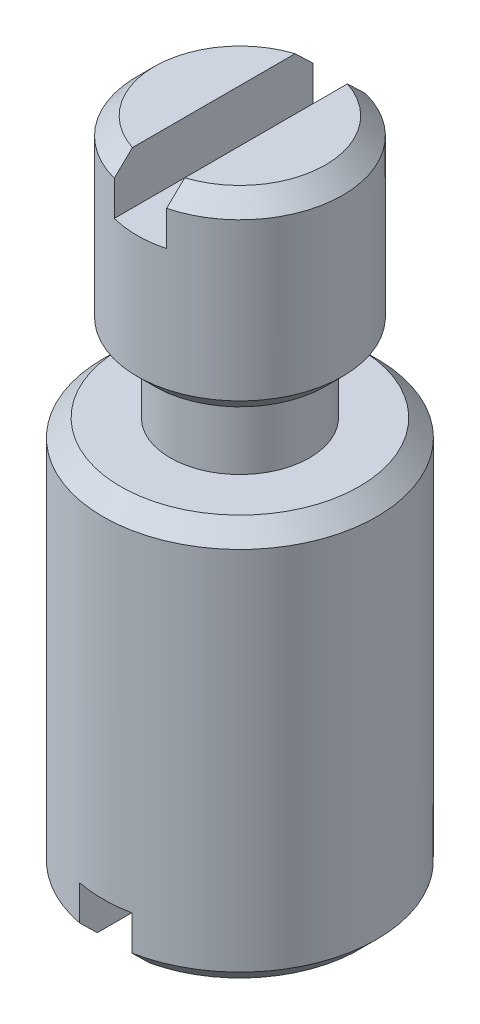
ISO-10303-21;
HEADER;
FILE_DESCRIPTION(('STEP AP214'),'2;1');
FILE_NAME('part.step','',(''),(''),'','','');
FILE_SCHEMA(('AUTOMOTIVE_DESIGN { 1 0 10303 214 1 1 1 1 }'));
ENDSEC;
DATA;
#1=APPLICATION_CONTEXT('core data for automotive mechanical design processes');
#2=APPLICATION_PROTOCOL_DEFINITION('international standard','automotive_design',2000,#1);
#3=PRODUCT_CONTEXT('',#1,'mechanical');
#4=PRODUCT('Part','Part','',(#3));
#5=PRODUCT_RELATED_PRODUCT_CATEGORY('part','',(#4));
#6=PRODUCT_DEFINITION_FORMATION('','',#4);
#7=PRODUCT_DEFINITION_CONTEXT('part definition',#1,'design');
#8=PRODUCT_DEFINITION('design','',#6,#7);
#9=PRODUCT_DEFINITION_SHAPE('','',#8);
#10=(LENGTH_UNIT() NAMED_UNIT(*) SI_UNIT(.MILLI.,.METRE.));
#11=(NAMED_UNIT(*) PLANE_ANGLE_UNIT() SI_UNIT($,.RADIAN.));
#12=(NAMED_UNIT(*) SI_UNIT($,.STERADIAN.) SOLID_ANGLE_UNIT());
#13=UNCERTAINTY_MEASURE_WITH_UNIT(LENGTH_MEASURE(1.E-05),#10,'distance_accuracy_value','');
#14=(GEOMETRIC_REPRESENTATION_CONTEXT(3) GLOBAL_UNCERTAINTY_ASSIGNED_CONTEXT((#13)) GLOBAL_UNIT_ASSIGNED_CONTEXT((#10,
#11,#12)) REPRESENTATION_CONTEXT('',''));
#15=CARTESIAN_POINT('',(0.,0.,0.));
#16=DIRECTION('',(0.,0.,1.));
#17=DIRECTION('',(1.,0.,0.));
#18=AXIS2_PLACEMENT_3D('',#15,#16,#17);
#19=CARTESIAN_POINT('',(0.915732833901788,-5.21771535189553,0.308982820399706));
#20=DIRECTION('',(0.,-1.,0.));
#21=DIRECTION('',(1.,0.,0.));
#22=AXIS2_PLACEMENT_3D('',#19,#20,#21);
#23=PLANE('',#22);
#24=CARTESIAN_POINT('',(-0.0812171660982131,-5.21771535189553,0.308982820399706));
#25=DIRECTION('',(0.,-1.,0.));
#26=DIRECTION('',(1.,0.,0.));
#27=AXIS2_PLACEMENT_3D('',#24,#25,#26);
#28=CIRCLE('',#27,1.7399);
#29=CARTESIAN_POINT('',(0.299782833901787,-5.21771535189553,-1.38868941239436));
#30=VERTEX_POINT('',#29);
#31=CARTESIAN_POINT('',(0.299782833901787,-5.21771535189553,2.00665505319377));
#32=VERTEX_POINT('',#31);
#33=EDGE_CURVE('E123',#30,#32,#28,.T.);
#34=ORIENTED_EDGE('',*,*,#33,.T.);
#35=DIRECTION('',(0.,0.,-1.));
#36=VECTOR('',#35,1.);
#37=CARTESIAN_POINT('',(0.299782833901787,-5.21771535189553,2.84898282039971));
#38=LINE('',#37,#36);
#39=EDGE_CURVE('E119',#32,#30,#38,.T.);
#40=ORIENTED_EDGE('',*,*,#39,.T.);
#41=EDGE_LOOP('',(#34,#40));
#42=FACE_BOUND('',#41,.T.);
#43=ADVANCED_FACE('F16',(#42),#23,.T.);
#44=CARTESIAN_POINT('',(-0.462217166098213,-5.21771535189553,2.00665505319377));
#45=VERTEX_POINT('',#44);
#46=CARTESIAN_POINT('',(-0.462217166098213,-5.21771535189553,-1.38868941239436));
#47=VERTEX_POINT('',#46);
#48=EDGE_CURVE('E117',#45,#47,#28,.T.);
#49=ORIENTED_EDGE('',*,*,#48,.T.);
#50=DIRECTION('',(0.,0.,-1.));
#51=VECTOR('',#50,1.);
#52=CARTESIAN_POINT('',(-0.462217166098213,-5.21771535189553,2.84898282039971));
#53=LINE('',#52,#51);
#54=EDGE_CURVE('E105',#45,#47,#53,.T.);
#55=ORIENTED_EDGE('',*,*,#54,.F.);
#56=EDGE_LOOP('',(#49,#55));
#57=FACE_BOUND('',#56,.T.);
#58=ADVANCED_FACE('F116',(#57),#23,.T.);
#59=CARTESIAN_POINT('',(-0.0812171660982131,-5.21771535189553,0.308982820399706));
#60=DIRECTION('',(0.,-1.,0.));
#61=DIRECTION('',(1.,0.,0.));
#62=AXIS2_PLACEMENT_3D('',#59,#60,#61);
#63=CYLINDRICAL_SURFACE('',#62,1.9939);
#64=CARTESIAN_POINT('',(-0.0812171660982129,0.370284648104464,0.308982820399706));
#65=DIRECTION('',(0.,1.,0.));
#66=DIRECTION('',(-1.,0.,0.));
#67=AXIS2_PLACEMENT_3D('',#64,#65,#66);
#68=CIRCLE('',#67,1.9939);
#69=CARTESIAN_POINT('',(-2.07511716609821,0.370284648104464,0.308982820399706));
#70=VERTEX_POINT('',#69);
#71=EDGE_CURVE('E122',#70,#70,#68,.F.);
#72=ORIENTED_EDGE('',*,*,#71,.T.);
#73=EDGE_LOOP('',(#72));
#74=FACE_BOUND('',#73,.T.);
#75=DIRECTION('',(0.,-1.,0.));
#76=VECTOR('',#75,1.);
#77=CARTESIAN_POINT('',(0.299782833901787,-5.21771535189553,2.26614306166765));
#78=LINE('',#77,#76);
#79=CARTESIAN_POINT('',(0.299782833901787,-4.96371535189553,2.26614306166765));
#80=VERTEX_POINT('',#79);
#81=CARTESIAN_POINT('',(0.299782833901787,-4.45571535189553,2.26614306166765));
#82=VERTEX_POINT('',#81);
#83=EDGE_CURVE('E391',#80,#82,#78,.F.);
#84=ORIENTED_EDGE('',*,*,#83,.F.);
#85=CARTESIAN_POINT('',(-0.0812171660982131,-4.96371535189553,0.308982820399706));
#86=DIRECTION('',(0.,-1.,0.));
#87=DIRECTION('',(1.,0.,0.));
#88=AXIS2_PLACEMENT_3D('',#85,#86,#87);
#89=CIRCLE('',#88,1.9939);
#90=CARTESIAN_POINT('',(0.299782833901787,-4.96371535189553,-1.64817742086824));
#91=VERTEX_POINT('',#90);
#92=EDGE_CURVE('E126',#80,#91,#89,.F.);
#93=ORIENTED_EDGE('',*,*,#92,.T.);
#94=DIRECTION('',(0.,-1.,0.));
#95=VECTOR('',#94,1.);
#96=CARTESIAN_POINT('',(0.299782833901787,-5.21771535189553,-1.64817742086824));
#97=LINE('',#96,#95);
#98=CARTESIAN_POINT('',(0.299782833901787,-4.45571535189553,-1.64817742086824));
#99=VERTEX_POINT('',#98);
#100=EDGE_CURVE('E396',#99,#91,#97,.T.);
#101=ORIENTED_EDGE('',*,*,#100,.F.);
#102=CARTESIAN_POINT('',(-0.081217166098213,-4.45571535189553,0.308982820399706));
#103=DIRECTION('',(0.,-1.,0.));
#104=DIRECTION('',(1.,0.,0.));
#105=AXIS2_PLACEMENT_3D('',#102,#103,#104);
#106=CIRCLE('',#105,1.9939);
#107=CARTESIAN_POINT('',(-0.462217166098213,-4.45571535189553,-1.64817742086824));
#108=VERTEX_POINT('',#107);
#109=EDGE_CURVE('E19',#108,#99,#106,.T.);
#110=ORIENTED_EDGE('',*,*,#109,.F.);
#111=DIRECTION('',(0.,-1.,0.));
#112=VECTOR('',#111,1.);
#113=CARTESIAN_POINT('',(-0.462217166098213,-5.21771535189553,-1.64817742086824));
#114=LINE('',#113,#112);
#115=CARTESIAN_POINT('',(-0.462217166098213,-4.96371535189553,-1.64817742086824));
#116=VERTEX_POINT('',#115);
#117=EDGE_CURVE('E401',#116,#108,#114,.F.);
#118=ORIENTED_EDGE('',*,*,#117,.F.);
#119=CARTESIAN_POINT('',(-0.462217166098213,-4.96371535189553,2.26614306166765));
#120=VERTEX_POINT('',#119);
#121=EDGE_CURVE('E135',#116,#120,#89,.F.);
#122=ORIENTED_EDGE('',*,*,#121,.T.);
#123=DIRECTION('',(0.,-1.,0.));
#124=VECTOR('',#123,1.);
#125=CARTESIAN_POINT('',(-0.462217166098213,-5.21771535189553,2.26614306166765));
#126=LINE('',#125,#124);
#127=CARTESIAN_POINT('',(-0.462217166098213,-4.45571535189553,2.26614306166765));
#128=VERTEX_POINT('',#127);
#129=EDGE_CURVE('E30',#128,#120,#126,.T.);
#130=ORIENTED_EDGE('',*,*,#129,.F.);
#131=EDGE_CURVE('E11',#82,#128,#106,.T.);
#132=ORIENTED_EDGE('',*,*,#131,.F.);
#133=EDGE_LOOP('',(#84,#93,#101,#110,#118,#122,#130,#132));
#134=FACE_BOUND('',#133,.T.);
#135=ADVANCED_FACE('F206',(#74,#134),#63,.T.);
#136=CARTESIAN_POINT('',(-0.0812171660982131,-5.21771535189553,0.308982820399706));
#137=DIRECTION('',(0.,1.,0.));
#138=DIRECTION('',(-1.,0.,0.));
#139=AXIS2_PLACEMENT_3D('',#136,#137,#138);
#140=CONICAL_SURFACE('',#139,1.7399,0.785398163397447);
#141=ORIENTED_EDGE('',*,*,#92,.F.);
#142=CARTESIAN_POINT('',(0.299782833901787,-2.56598676136736,4.68405318293611));
#143=CARTESIAN_POINT('',(0.299782833901787,-2.72200373650391,4.52744015359932));
#144=CARTESIAN_POINT('',(0.299782833901787,-2.87799430736226,4.37080077142386));
#145=CARTESIAN_POINT('',(0.299782833901787,-3.18989511725234,4.05742230140129));
#146=CARTESIAN_POINT('',(0.299782833901787,-3.34580535056861,3.90068320786615));
#147=CARTESIAN_POINT('',(0.299782833901787,-3.65773478474805,3.58684009759875));
#148=CARTESIAN_POINT('',(0.299782833901787,-3.81375379169579,3.42973588810915));
#149=CARTESIAN_POINT('',(0.299782833901787,-4.12558446698339,3.11534089692155));
#150=CARTESIAN_POINT('',(0.299782833901787,-4.28139614750308,2.9580501273123));
#151=CARTESIAN_POINT('',(0.299782833901787,-4.58302555307963,2.65291362198985));
#152=CARTESIAN_POINT('',(0.299782833901787,-4.72886327857073,2.50508765830294));
#153=CARTESIAN_POINT('',(0.299782833901787,-5.0200584893413,2.20891096269024));
#154=CARTESIAN_POINT('',(0.299782833901787,-5.16541588542354,2.06056014284426));
#155=CARTESIAN_POINT('',(0.299782833901787,-5.38258985735926,1.83732553120053));
#156=CARTESIAN_POINT('',(0.299782833901787,-5.45480488828533,1.76282992827134));
#157=CARTESIAN_POINT('',(0.299782833901787,-5.59881670408933,1.61342552818835));
#158=CARTESIAN_POINT('',(0.299782833901787,-5.67061345988452,1.53851670299181));
#159=CARTESIAN_POINT('',(0.299782833901787,-5.81349536442505,1.38806531640886));
#160=CARTESIAN_POINT('',(0.299782833901787,-5.88458073528636,1.31252296728566));
#161=CARTESIAN_POINT('',(0.299782833901787,-5.99022234910422,1.19830367671421));
#162=CARTESIAN_POINT('',(0.299782833901787,-6.0252698832036,1.16008177894726));
#163=CARTESIAN_POINT('',(0.299782833901787,-6.0948830748193,1.0832023270411));
#164=CARTESIAN_POINT('',(0.299782833901787,-6.12944875174194,1.04454479056086));
#165=CARTESIAN_POINT('',(0.299782833901787,-6.18277029836172,0.98376568759239));
#166=CARTESIAN_POINT('',(0.299782833901787,-6.2017790311131,0.961866199113733));
#167=CARTESIAN_POINT('',(0.299782833901787,-6.23949581257323,0.917805382405927));
#168=CARTESIAN_POINT('',(0.299782833901787,-6.2582038312874,0.895644028434977));
#169=CARTESIAN_POINT('',(0.299782833901787,-6.29541854275912,0.850742308755953));
#170=CARTESIAN_POINT('',(0.299782833901787,-6.3139208120943,0.827998263826086));
#171=CARTESIAN_POINT('',(0.299782833901787,-6.35035184143969,0.782062152574052));
#172=CARTESIAN_POINT('',(0.299782833901787,-6.36828074212845,0.75887019842328));
#173=CARTESIAN_POINT('',(0.299782833901787,-6.40354060306363,0.711586507596284));
#174=CARTESIAN_POINT('',(0.299782833901787,-6.42086152185643,0.687487220460601));
#175=CARTESIAN_POINT('',(0.299782833901787,-6.45427844212947,0.638394200071759));
#176=CARTESIAN_POINT('',(0.299782833901787,-6.4703727772449,0.613399315532911));
#177=CARTESIAN_POINT('',(0.299782833901787,-6.50043128294747,0.562506921998264));
#178=CARTESIAN_POINT('',(0.299782833901787,-6.51441705114403,0.536622458995947));
#179=CARTESIAN_POINT('',(0.299782833901787,-6.53924039424292,0.483418415506578));
#180=CARTESIAN_POINT('',(0.299782833901787,-6.55008793601253,0.456103711226025));
#181=CARTESIAN_POINT('',(0.299782833901787,-6.56611917234051,0.402280540122545));
#182=CARTESIAN_POINT('',(0.299782833901787,-6.5717048351492,0.375899804689169));
#183=CARTESIAN_POINT('',(0.299782833901787,-6.57727885733447,0.322629871891934));
#184=CARTESIAN_POINT('',(0.299782833901787,-6.5772934889692,0.29574365910531));
#185=CARTESIAN_POINT('',(0.299782833901787,-6.57180157281784,0.242725031037734));
#186=CARTESIAN_POINT('',(0.299782833901787,-6.56632373638415,0.216589422874238));
#187=CARTESIAN_POINT('',(0.299782833901787,-6.55500985213787,0.178282918065058));
#188=CARTESIAN_POINT('',(0.299782833901787,-6.55070031986979,0.16561779616792));
#189=CARTESIAN_POINT('',(0.299782833901787,-6.5412296084845,0.14061050725627));
#190=CARTESIAN_POINT('',(0.299782833901787,-6.53606856905918,0.128268287652963));
#191=CARTESIAN_POINT('',(0.299782833901787,-6.52062147568258,0.0940625211855799));
#192=CARTESIAN_POINT('',(0.299782833901787,-6.5095602484456,0.072551796414975));
#193=CARTESIAN_POINT('',(0.299782833901787,-6.48593204034648,0.0303655472672012));
#194=CARTESIAN_POINT('',(0.299782833901787,-6.47336336360837,0.0096909992068965));
#195=CARTESIAN_POINT('',(0.299782833901787,-6.43406145496094,-0.0514892396044827));
#196=CARTESIAN_POINT('',(0.299782833901787,-6.40580608206753,-0.0910071005636982));
#197=CARTESIAN_POINT('',(0.299782833901787,-6.3470109409457,-0.168843487507131));
#198=CARTESIAN_POINT('',(0.299782833901787,-6.31645184494766,-0.207146856122605));
#199=CARTESIAN_POINT('',(0.299782833901787,-6.25421492487309,-0.282681789122828));
#200=CARTESIAN_POINT('',(0.299782833901787,-6.2225398748979,-0.319915643973077));
#201=CARTESIAN_POINT('',(0.299782833901787,-6.1591518265526,-0.392944822539864));
#202=CARTESIAN_POINT('',(0.299782833901787,-6.12745446550025,-0.428753841923004));
#203=CARTESIAN_POINT('',(0.299782833901787,-6.06358736080788,-0.499948964404729));
#204=CARTESIAN_POINT('',(0.299782833901787,-6.03141760533633,-0.535335056870337));
#205=CARTESIAN_POINT('',(0.299782833901787,-5.93441407671299,-0.641056808274501));
#206=CARTESIAN_POINT('',(0.299782833901787,-5.86909483170476,-0.710946000064772));
#207=CARTESIAN_POINT('',(0.299782833901787,-5.73768463578304,-0.850148496391916));
#208=CARTESIAN_POINT('',(0.299782833901787,-5.67159285867681,-0.919461016217661));
#209=CARTESIAN_POINT('',(0.299782833901787,-5.53898353428549,-1.05766697169385));
#210=CARTESIAN_POINT('',(0.299782833901787,-5.47246602038852,-1.12656043940137));
#211=CARTESIAN_POINT('',(0.299782833901787,-5.27372711150933,-1.33158294737623));
#212=CARTESIAN_POINT('',(0.299782833901787,-5.141106882691,-1.46732481811263));
#213=CARTESIAN_POINT('',(0.299782833901787,-4.8754048309082,-1.73823746550535));
#214=CARTESIAN_POINT('',(0.299782833901787,-4.74232323671362,-1.8734084671581));
#215=CARTESIAN_POINT('',(0.299782833901787,-4.44022303456544,-2.17956753442974));
#216=CARTESIAN_POINT('',(0.299782833901787,-4.27111304715661,-2.35046541956537));
#217=CARTESIAN_POINT('',(0.299782833901787,-3.93260117858493,-2.69202620720749));
#218=CARTESIAN_POINT('',(0.299782833901787,-3.76319925475647,-2.8626890673857));
#219=CARTESIAN_POINT('',(0.299782833901787,-3.42254437272776,-3.20555142304486));
#220=CARTESIAN_POINT('',(0.299782833901787,-3.25128978131235,-3.37774929565275));
#221=CARTESIAN_POINT('',(0.299782833901787,-2.90869569615637,-3.7220039318154));
#222=CARTESIAN_POINT('',(0.299782833901787,-2.73735622112611,-3.89406071398829));
#223=CARTESIAN_POINT('',(0.299782833901787,-2.56598676136736,-4.06608754213669));
#224=B_SPLINE_CURVE_WITH_KNOTS('',3,(#142,#143,#144,#145,#146,#147,#148,#149,#150,#151,#152,
#153,#154,#155,#156,#157,#158,#159,#160,#161,#162,#163,#164,#165,#166,#167,#168,#169,#170,#171,
#172,#173,#174,#175,#176,#177,#178,#179,#180,#181,#182,#183,#184,#185,#186,#187,#188,#189,#190,
#191,#192,#193,#194,#195,#196,#197,#198,#199,#200,#201,#202,#203,#204,#205,#206,#207,#208,#209,
#210,#211,#212,#213,#214,#215,#216,#217,#218,#219,#220,#221,#222,#223),.UNSPECIFIED.,.F.,.F.,(4,
2,2,2,2,2,2,2,2,2,2,2,2,2,2,2,2,2,2,2,2,2,2,2,2,2,2,2,2,2,2,2,2,2,2,2,2,2,2,2,4),(0.,
0.66318964618465,1.32642130808637,1.99065986570894,2.65485750697323,3.27782619310683,
3.90090470627766,4.21216133345616,4.52343935006813,4.83461693740074,4.9901883526421,
5.14575348419403,5.23274732464184,5.31974978906844,5.40770147553878,5.49563141447957,
5.58464071767716,5.67376886442957,5.76191091694143,5.84976988136644,5.93018577623416,
6.01022243548545,6.08984288069563,6.12995499280078,6.17006053094415,6.2425261275838,
6.31507402626497,6.46065365115201,6.60763097328969,6.75426565615412,6.8977289324701,
7.04119580809867,7.3281693620236,7.61548458273877,7.90277754049723,8.47209456092082,
9.0411610885753,9.76243599583125,10.4838271930817,11.212402568282,11.9408575276252),.UNSPECIFIED.);
#225=EDGE_CURVE('E215',#80,#32,#224,.T.);
#226=ORIENTED_EDGE('',*,*,#225,.T.);
#227=ORIENTED_EDGE('',*,*,#33,.F.);
#228=EDGE_CURVE('E214',#30,#91,#224,.T.);
#229=ORIENTED_EDGE('',*,*,#228,.T.);
#230=EDGE_LOOP('',(#141,#226,#227,#229));
#231=FACE_BOUND('',#230,.T.);
#232=ADVANCED_FACE('F213',(#231),#140,.T.);
#233=ORIENTED_EDGE('',*,*,#121,.F.);
#234=CARTESIAN_POINT('',(-0.462217166098213,-2.56598676136736,-4.0660875421367));
#235=CARTESIAN_POINT('',(-0.462217166098213,-2.7220037365039,-3.90947451279991));
#236=CARTESIAN_POINT('',(-0.462217166098213,-2.87799430736226,-3.75283513062445));
#237=CARTESIAN_POINT('',(-0.462217166098213,-3.18989511725233,-3.43945666060189));
#238=CARTESIAN_POINT('',(-0.462217166098213,-3.34580535056861,-3.28271756706674));
#239=CARTESIAN_POINT('',(-0.462217166098213,-3.65773478474804,-2.96887445679934));
#240=CARTESIAN_POINT('',(-0.462217166098213,-3.81375379169578,-2.81177024730975));
#241=CARTESIAN_POINT('',(-0.462217166098213,-4.12558446698338,-2.49737525612214));
#242=CARTESIAN_POINT('',(-0.462217166098213,-4.28139614750307,-2.3400844865129));
#243=CARTESIAN_POINT('',(-0.462217166098213,-4.58302555307962,-2.03494798119045));
#244=CARTESIAN_POINT('',(-0.462217166098213,-4.72886327857072,-1.88712201750354));
#245=CARTESIAN_POINT('',(-0.462217166098213,-5.02005848934129,-1.59094532189084));
#246=CARTESIAN_POINT('',(-0.462217166098213,-5.16541588542354,-1.44259450204485));
#247=CARTESIAN_POINT('',(-0.462217166098213,-5.38258985735925,-1.21935989040113));
#248=CARTESIAN_POINT('',(-0.462217166098213,-5.45480488828532,-1.14486428747194));
#249=CARTESIAN_POINT('',(-0.462217166098213,-5.59881670408932,-0.995459887388947));
#250=CARTESIAN_POINT('',(-0.462217166098213,-5.67061345988452,-0.9205510621924));
#251=CARTESIAN_POINT('',(-0.462217166098213,-5.81349536442505,-0.770099675609454));
#252=CARTESIAN_POINT('',(-0.462217166098213,-5.88458073528636,-0.694557326486253));
#253=CARTESIAN_POINT('',(-0.462217166098213,-5.99022234910422,-0.580338035914802));
#254=CARTESIAN_POINT('',(-0.462217166098213,-6.02526988320359,-0.542116138147852));
#255=CARTESIAN_POINT('',(-0.462217166098213,-6.0948830748193,-0.465236686241694));
#256=CARTESIAN_POINT('',(-0.462217166098213,-6.12944875174194,-0.426579149761451));
#257=CARTESIAN_POINT('',(-0.462217166098213,-6.18277029836172,-0.36580004679298));
#258=CARTESIAN_POINT('',(-0.462217166098213,-6.20177903111309,-0.343900558314324));
#259=CARTESIAN_POINT('',(-0.462217166098213,-6.23949581257323,-0.299839741606518));
#260=CARTESIAN_POINT('',(-0.462217166098213,-6.2582038312874,-0.277678387635568));
#261=CARTESIAN_POINT('',(-0.462217166098213,-6.29541854275911,-0.232776667956544));
#262=CARTESIAN_POINT('',(-0.462217166098213,-6.3139208120943,-0.210032623026676));
#263=CARTESIAN_POINT('',(-0.462217166098213,-6.35035184143969,-0.164096511774642));
#264=CARTESIAN_POINT('',(-0.462217166098213,-6.36828074212845,-0.140904557623869));
#265=CARTESIAN_POINT('',(-0.462217166098213,-6.40354060306363,-0.0936208667968733));
#266=CARTESIAN_POINT('',(-0.462217166098213,-6.42086152185642,-0.0695215796611895));
#267=CARTESIAN_POINT('',(-0.462217166098213,-6.45427844212947,-0.0204285592723475));
#268=CARTESIAN_POINT('',(-0.462217166098213,-6.4703727772449,0.00456632526650022));
#269=CARTESIAN_POINT('',(-0.462217166098213,-6.50043128294747,0.055458718801147));
#270=CARTESIAN_POINT('',(-0.462217166098213,-6.51441705114403,0.0813431818034636));
#271=CARTESIAN_POINT('',(-0.462217166098213,-6.53924039424292,0.134547225292833));
#272=CARTESIAN_POINT('',(-0.462217166098213,-6.55008793601253,0.161861929573386));
#273=CARTESIAN_POINT('',(-0.462217166098213,-6.56611917234051,0.215685100676867));
#274=CARTESIAN_POINT('',(-0.462217166098213,-6.5717048351492,0.242065836110242));
#275=CARTESIAN_POINT('',(-0.462217166098213,-6.57727885733447,0.295335768907478));
#276=CARTESIAN_POINT('',(-0.462217166098213,-6.5772934889692,0.322221981694102));
#277=CARTESIAN_POINT('',(-0.462217166098213,-6.57180157281784,0.375240609761677));
#278=CARTESIAN_POINT('',(-0.462217166098213,-6.56632373638415,0.401376217925174));
#279=CARTESIAN_POINT('',(-0.462217166098213,-6.55500985213787,0.439682722734353));
#280=CARTESIAN_POINT('',(-0.462217166098213,-6.55070031986979,0.452347844631492));
#281=CARTESIAN_POINT('',(-0.462217166098213,-6.5412296084845,0.477355133543143));
#282=CARTESIAN_POINT('',(-0.462217166098213,-6.53606856905918,0.489697353146449));
#283=CARTESIAN_POINT('',(-0.462217166098213,-6.52062147568258,0.523903119613832));
#284=CARTESIAN_POINT('',(-0.462217166098213,-6.5095602484456,0.545413844384438));
#285=CARTESIAN_POINT('',(-0.462217166098213,-6.48593204034648,0.587600093532212));
#286=CARTESIAN_POINT('',(-0.462217166098213,-6.47336336360837,0.608274641592516));
#287=CARTESIAN_POINT('',(-0.462217166098213,-6.43406145496094,0.669454880403895));
#288=CARTESIAN_POINT('',(-0.462217166098213,-6.40580608206753,0.708972741363111));
#289=CARTESIAN_POINT('',(-0.462217166098213,-6.3470109409457,0.786809128306543));
#290=CARTESIAN_POINT('',(-0.462217166098213,-6.31645184494766,0.825112496922016));
#291=CARTESIAN_POINT('',(-0.462217166098213,-6.25421492487308,0.90064742992224));
#292=CARTESIAN_POINT('',(-0.462217166098213,-6.2225398748979,0.937881284772489));
#293=CARTESIAN_POINT('',(-0.462217166098213,-6.15915182655259,1.01091046333928));
#294=CARTESIAN_POINT('',(-0.462217166098213,-6.12745446550024,1.04671948272242));
#295=CARTESIAN_POINT('',(-0.462217166098213,-6.06358736080788,1.11791460520414));
#296=CARTESIAN_POINT('',(-0.462217166098213,-6.03141760533633,1.15330069766975));
#297=CARTESIAN_POINT('',(-0.462217166098213,-5.93441407671299,1.25902244907392));
#298=CARTESIAN_POINT('',(-0.462217166098213,-5.86909483170475,1.32891164086419));
#299=CARTESIAN_POINT('',(-0.462217166098213,-5.73768463578304,1.46811413719133));
#300=CARTESIAN_POINT('',(-0.462217166098213,-5.67159285867681,1.53742665701708));
#301=CARTESIAN_POINT('',(-0.462217166098213,-5.53898353428549,1.67563261249327));
#302=CARTESIAN_POINT('',(-0.462217166098213,-5.47246602038852,1.74452608020078));
#303=CARTESIAN_POINT('',(-0.462217166098213,-5.27372711150933,1.94954858817564));
#304=CARTESIAN_POINT('',(-0.462217166098213,-5.14110688269099,2.08529045891205));
#305=CARTESIAN_POINT('',(-0.462217166098213,-4.8754048309082,2.35620310630477));
#306=CARTESIAN_POINT('',(-0.462217166098213,-4.74232323671361,2.49137410795752));
#307=CARTESIAN_POINT('',(-0.462217166098213,-4.44022303456544,2.79753317522916));
#308=CARTESIAN_POINT('',(-0.462217166098213,-4.27111304715661,2.96843106036478));
#309=CARTESIAN_POINT('',(-0.462217166098213,-3.93260117858493,3.30999184800691));
#310=CARTESIAN_POINT('',(-0.462217166098213,-3.76319925475646,3.48065470818511));
#311=CARTESIAN_POINT('',(-0.462217166098213,-3.42254437272776,3.82351706384427));
#312=CARTESIAN_POINT('',(-0.462217166098213,-3.25128978131235,3.99571493645217));
#313=CARTESIAN_POINT('',(-0.462217166098213,-2.90869569615637,4.33996957261482));
#314=CARTESIAN_POINT('',(-0.462217166098213,-2.73735622112611,4.5120263547877));
#315=CARTESIAN_POINT('',(-0.462217166098213,-2.56598676136736,4.68405318293611));
#316=B_SPLINE_CURVE_WITH_KNOTS('',3,(#234,#235,#236,#237,#238,#239,#240,#241,#242,#243,#244,
#245,#246,#247,#248,#249,#250,#251,#252,#253,#254,#255,#256,#257,#258,#259,#260,#261,#262,#263,
#264,#265,#266,#267,#268,#269,#270,#271,#272,#273,#274,#275,#276,#277,#278,#279,#280,#281,#282,
#283,#284,#285,#286,#287,#288,#289,#290,#291,#292,#293,#294,#295,#296,#297,#298,#299,#300,#301,
#302,#303,#304,#305,#306,#307,#308,#309,#310,#311,#312,#313,#314,#315),.UNSPECIFIED.,.F.,.F.,(4,
2,2,2,2,2,2,2,2,2,2,2,2,2,2,2,2,2,2,2,2,2,2,2,2,2,2,2,2,2,2,2,2,2,2,2,2,2,2,2,4),(0.,
0.663189646184648,1.32642130808636,1.99065986570893,2.65485750697322,3.27782619310682,
3.90090470627766,4.21216133345616,4.52343935006813,4.83461693740074,4.9901883526421,
5.14575348419404,5.23274732464184,5.31974978906844,5.40770147553879,5.49563141447958,
5.58464071767716,5.67376886442958,5.76191091694143,5.84976988136644,5.93018577623416,
6.01022243548546,6.08984288069564,6.12995499280078,6.17006053094415,6.2425261275838,
6.31507402626498,6.46065365115202,6.6076309732897,6.75426565615413,6.8977289324701,
7.04119580809868,7.32816936202361,7.61548458273878,7.90277754049724,8.47209456092084,
9.04116108857531,9.76243599583126,10.4838271930817,11.212402568282,11.9408575276252),.UNSPECIFIED.);
#317=EDGE_CURVE('E111',#116,#47,#316,.T.);
#318=ORIENTED_EDGE('',*,*,#317,.T.);
#319=ORIENTED_EDGE('',*,*,#48,.F.);
#320=EDGE_CURVE('E102',#45,#120,#316,.T.);
#321=ORIENTED_EDGE('',*,*,#320,.T.);
#322=EDGE_LOOP('',(#233,#318,#319,#321));
#323=FACE_BOUND('',#322,.T.);
#324=ADVANCED_FACE('F121',(#323),#140,.T.);
#325=CARTESIAN_POINT('',(-0.0812171660982131,-5.21771535189553,0.308982820399706));
#326=DIRECTION('',(0.,-1.,0.));
#327=DIRECTION('',(1.,0.,0.));
#328=AXIS2_PLACEMENT_3D('',#325,#326,#327);
#329=CYLINDRICAL_SURFACE('',#328,1.4986);
#330=CARTESIAN_POINT('',(-0.0812171660982129,1.89428464810448,0.308982820399706));
#331=DIRECTION('',(0.,-1.,0.));
#332=DIRECTION('',(1.,0.,0.));
#333=AXIS2_PLACEMENT_3D('',#330,#331,#332);
#334=CIRCLE('',#333,1.4986);
#335=CARTESIAN_POINT('',(1.41738283390179,1.89428464810448,0.308982820399706));
#336=VERTEX_POINT('',#335);
#337=EDGE_CURVE('E136',#336,#336,#334,.F.);
#338=ORIENTED_EDGE('',*,*,#337,.T.);
#339=EDGE_LOOP('',(#338));
#340=FACE_BOUND('',#339,.T.);
#341=DIRECTION('',(0.,-1.,0.));
#342=VECTOR('',#341,1.);
#343=CARTESIAN_POINT('',(0.299782833901788,-5.21771535189553,-1.1403759895573));
#344=LINE('',#343,#342);
#345=CARTESIAN_POINT('',(0.299782833901786,4.18028464810448,-1.1403759895573));
#346=VERTEX_POINT('',#345);
#347=CARTESIAN_POINT('',(0.299782833901786,3.67228464810448,-1.1403759895573));
#348=VERTEX_POINT('',#347);
#349=EDGE_CURVE('E416',#346,#348,#344,.T.);
#350=ORIENTED_EDGE('',*,*,#349,.F.);
#351=CARTESIAN_POINT('',(-0.0812171660982128,4.18028464810448,0.308982820399706));
#352=DIRECTION('',(0.,1.,0.));
#353=DIRECTION('',(-1.,0.,0.));
#354=AXIS2_PLACEMENT_3D('',#351,#352,#353);
#355=CIRCLE('',#354,1.4986);
#356=CARTESIAN_POINT('',(0.299782833901786,4.18028464810448,1.75834163035672));
#357=VERTEX_POINT('',#356);
#358=EDGE_CURVE('E142',#346,#357,#355,.F.);
#359=ORIENTED_EDGE('',*,*,#358,.T.);
#360=DIRECTION('',(0.,-1.,0.));
#361=VECTOR('',#360,1.);
#362=CARTESIAN_POINT('',(0.299782833901788,-5.21771535189553,1.75834163035672));
#363=LINE('',#362,#361);
#364=CARTESIAN_POINT('',(0.299782833901786,3.67228464810448,1.75834163035672));
#365=VERTEX_POINT('',#364);
#366=EDGE_CURVE('E414',#365,#357,#363,.F.);
#367=ORIENTED_EDGE('',*,*,#366,.F.);
#368=CARTESIAN_POINT('',(-0.0812171660982128,3.67228464810448,0.308982820399706));
#369=DIRECTION('',(0.,1.,0.));
#370=DIRECTION('',(0.,0.,1.));
#371=AXIS2_PLACEMENT_3D('',#368,#369,#370);
#372=CIRCLE('',#371,1.4986);
#373=CARTESIAN_POINT('',(-0.462217166098214,3.67228464810448,1.75834163035671));
#374=VERTEX_POINT('',#373);
#375=EDGE_CURVE('E436',#374,#365,#372,.T.);
#376=ORIENTED_EDGE('',*,*,#375,.F.);
#377=DIRECTION('',(0.,-1.,0.));
#378=VECTOR('',#377,1.);
#379=CARTESIAN_POINT('',(-0.462217166098214,-5.21771535189553,1.75834163035672));
#380=LINE('',#379,#378);
#381=CARTESIAN_POINT('',(-0.462217166098214,4.18028464810448,1.75834163035671));
#382=VERTEX_POINT('',#381);
#383=EDGE_CURVE('E412',#382,#374,#380,.T.);
#384=ORIENTED_EDGE('',*,*,#383,.F.);
#385=CARTESIAN_POINT('',(-0.462217166098214,4.18028464810448,-1.1403759895573));
#386=VERTEX_POINT('',#385);
#387=EDGE_CURVE('E139',#382,#386,#355,.F.);
#388=ORIENTED_EDGE('',*,*,#387,.T.);
#389=DIRECTION('',(0.,-1.,0.));
#390=VECTOR('',#389,1.);
#391=CARTESIAN_POINT('',(-0.462217166098214,-5.21771535189553,-1.1403759895573));
#392=LINE('',#391,#390);
#393=CARTESIAN_POINT('',(-0.462217166098214,3.67228464810448,-1.1403759895573));
#394=VERTEX_POINT('',#393);
#395=EDGE_CURVE('E38',#394,#386,#392,.F.);
#396=ORIENTED_EDGE('',*,*,#395,.F.);
#397=EDGE_CURVE('E112',#348,#394,#372,.T.);
#398=ORIENTED_EDGE('',*,*,#397,.F.);
#399=EDGE_LOOP('',(#350,#359,#367,#376,#384,#388,#396,#398));
#400=FACE_BOUND('',#399,.T.);
#401=ADVANCED_FACE('F335',(#340,#400),#329,.T.);
#402=CARTESIAN_POINT('',(0.915732833901788,4.43428464810448,0.308982820399706));
#403=DIRECTION('',(0.,1.,0.));
#404=DIRECTION('',(-1.,0.,0.));
#405=AXIS2_PLACEMENT_3D('',#402,#403,#404);
#406=PLANE('',#405);
#407=CARTESIAN_POINT('',(-0.0812171660982128,4.43428464810448,0.308982820399706));
#408=DIRECTION('',(0.,1.,0.));
#409=DIRECTION('',(-1.,0.,0.));
#410=AXIS2_PLACEMENT_3D('',#407,#408,#409);
#411=CIRCLE('',#410,1.2446);
#412=CARTESIAN_POINT('',(0.299782833901786,4.43428464810448,1.49383224543227));
#413=VERTEX_POINT('',#412);
#414=CARTESIAN_POINT('',(0.299782833901786,4.43428464810448,-0.875866604632857));
#415=VERTEX_POINT('',#414);
#416=EDGE_CURVE('E146',#413,#415,#411,.T.);
#417=ORIENTED_EDGE('',*,*,#416,.T.);
#418=DIRECTION('',(0.,0.,-1.));
#419=VECTOR('',#418,1.);
#420=CARTESIAN_POINT('',(0.299782833901786,4.43428464810448,2.84898282039971));
#421=LINE('',#420,#419);
#422=EDGE_CURVE('E409',#413,#415,#421,.T.);
#423=ORIENTED_EDGE('',*,*,#422,.F.);
#424=EDGE_LOOP('',(#417,#423));
#425=FACE_BOUND('',#424,.T.);
#426=ADVANCED_FACE('F326',(#425),#406,.T.);
#427=CARTESIAN_POINT('',(-0.462217166098214,4.43428464810448,-0.875866604632856));
#428=VERTEX_POINT('',#427);
#429=CARTESIAN_POINT('',(-0.462217166098214,4.43428464810448,1.49383224543227));
#430=VERTEX_POINT('',#429);
#431=EDGE_CURVE('E143',#428,#430,#411,.T.);
#432=ORIENTED_EDGE('',*,*,#431,.T.);
#433=DIRECTION('',(0.,0.,-1.));
#434=VECTOR('',#433,1.);
#435=CARTESIAN_POINT('',(-0.462217166098214,4.43428464810448,2.84898282039971));
#436=LINE('',#435,#434);
#437=EDGE_CURVE('E406',#430,#428,#436,.T.);
#438=ORIENTED_EDGE('',*,*,#437,.T.);
#439=EDGE_LOOP('',(#432,#438));
#440=FACE_BOUND('',#439,.T.);
#441=ADVANCED_FACE('F317',(#440),#406,.T.);
#442=CARTESIAN_POINT('',(-0.0812171660982128,4.18028464810448,0.308982820399706));
#443=DIRECTION('',(0.,-1.,0.));
#444=DIRECTION('',(1.,0.,0.));
#445=AXIS2_PLACEMENT_3D('',#442,#443,#444);
#446=CONICAL_SURFACE('',#445,1.4986,0.785398163397447);
#447=ORIENTED_EDGE('',*,*,#358,.F.);
#448=CARTESIAN_POINT('',(0.299782833901786,2.37531857395525,-2.97253935783857));
#449=CARTESIAN_POINT('',(0.299782833901786,2.46310430413405,-2.88416211956705));
#450=CARTESIAN_POINT('',(0.299782833901786,2.55086804535553,-2.79576302380779));
#451=CARTESIAN_POINT('',(0.299782833901786,2.72635095682005,-2.61888667873832));
#452=CARTESIAN_POINT('',(0.299782833901786,2.81407011515969,-2.53040941761928));
#453=CARTESIAN_POINT('',(0.299782833901786,2.98978419735345,-2.35301818806325));
#454=CARTESIAN_POINT('',(0.299782833901786,3.07777880024613,-2.26410390156502));
#455=CARTESIAN_POINT('',(0.299782833901786,3.25364136028794,-2.08618383649959));
#456=CARTESIAN_POINT('',(0.299782833901786,3.34150933844523,-1.9971780786901));
#457=CARTESIAN_POINT('',(0.299782833901786,3.56841351393151,-1.76695451499003));
#458=CARTESIAN_POINT('',(0.299782833901786,3.7073383152395,-1.62562669834834));
#459=CARTESIAN_POINT('',(0.299782833901786,3.91524873692254,-1.41306885248616));
#460=CARTESIAN_POINT('',(0.299782833901786,3.98449747026256,-1.34209635627432));
#461=CARTESIAN_POINT('',(0.299782833901786,4.12272883436817,-1.19990410084509));
#462=CARTESIAN_POINT('',(0.299782833901786,4.19171148679401,-1.12868436269115));
#463=CARTESIAN_POINT('',(0.299782833901786,4.3290181590714,-0.986141600983534));
#464=CARTESIAN_POINT('',(0.299782833901786,4.39734369430996,-0.91482004183219));
#465=CARTESIAN_POINT('',(0.299782833901786,4.5333733966081,-0.771544677844531));
#466=CARTESIAN_POINT('',(0.299782833901786,4.60107736216422,-0.699590681818262));
#467=CARTESIAN_POINT('',(0.299782833901786,4.73527669964315,-0.554735178241977));
#468=CARTESIAN_POINT('',(0.299782833901786,4.80177361407605,-0.481835119311739));
#469=CARTESIAN_POINT('',(0.299782833901786,4.89970244103236,-0.370909527320439));
#470=CARTESIAN_POINT('',(0.299782833901786,4.93203471431227,-0.333681316821336));
#471=CARTESIAN_POINT('',(0.299782833901786,4.99573777161094,-0.258413733670095));
#472=CARTESIAN_POINT('',(0.299782833901786,5.02710875323691,-0.220374530492631));
#473=CARTESIAN_POINT('',(0.299782833901786,5.06910479964591,-0.167197336931333));
#474=CARTESIAN_POINT('',(0.299782833901786,5.08043332784182,-0.152616422376458));
#475=CARTESIAN_POINT('',(0.299782833901786,5.10279604888717,-0.12323001114619));
#476=CARTESIAN_POINT('',(0.299782833901786,5.11383022279646,-0.108424500114885));
#477=CARTESIAN_POINT('',(0.299782833901786,5.14644081968436,-0.0635270369314353));
#478=CARTESIAN_POINT('',(0.299782833901786,5.16746795170523,-0.0330254758317295));
#479=CARTESIAN_POINT('',(0.299782833901786,5.20638127811425,0.0285322460217664));
#480=CARTESIAN_POINT('',(0.299782833901786,5.22434873143222,0.05953614175061));
#481=CARTESIAN_POINT('',(0.299782833901786,5.2560752946126,0.123583796968964));
#482=CARTESIAN_POINT('',(0.299782833901786,5.26985619028297,0.156615882360527));
#483=CARTESIAN_POINT('',(0.299782833901786,5.28648561714368,0.212789611183597));
#484=CARTESIAN_POINT('',(0.299782833901786,5.2914793260476,0.235268426269624));
#485=CARTESIAN_POINT('',(0.299782833901786,5.29749355824316,0.280697438724269));
#486=CARTESIAN_POINT('',(0.299782833901786,5.2985293959135,0.303645473057622));
#487=CARTESIAN_POINT('',(0.299782833901786,5.2964359011919,0.349333601734806));
#488=CARTESIAN_POINT('',(0.299782833901786,5.29330727974414,0.372073730904353));
#489=CARTESIAN_POINT('',(0.299782833901786,5.28352065231588,0.416846455128165));
#490=CARTESIAN_POINT('',(0.299782833901786,5.27684633553933,0.438875277163318));
#491=CARTESIAN_POINT('',(0.299782833901786,5.25904412256021,0.487091649457533));
#492=CARTESIAN_POINT('',(0.299782833901786,5.24723373256715,0.513018181112781));
#493=CARTESIAN_POINT('',(0.299782833901786,5.22114118415458,0.563617672566344));
#494=CARTESIAN_POINT('',(0.299782833901786,5.20685343675676,0.588287631079611));
#495=CARTESIAN_POINT('',(0.299782833901786,5.17661231743277,0.63682164613519));
#496=CARTESIAN_POINT('',(0.299782833901786,5.16064744085404,0.660678419111899));
#497=CARTESIAN_POINT('',(0.299782833901786,5.12770140556822,0.707631212339195));
#498=CARTESIAN_POINT('',(0.299782833901786,5.11072137935322,0.730728037360196));
#499=CARTESIAN_POINT('',(0.299782833901786,5.07405441372774,0.779018254599423));
#500=CARTESIAN_POINT('',(0.299782833901786,5.05428129792062,0.804145804760432));
#501=CARTESIAN_POINT('',(0.299782833901786,5.01413081713918,0.853914995379638));
#502=CARTESIAN_POINT('',(0.299782833901786,4.99375338213952,0.878556578971406));
#503=CARTESIAN_POINT('',(0.299782833901786,4.93197063137416,0.951965362514433));
#504=CARTESIAN_POINT('',(0.299782833901786,4.88993049050196,1.00019667526872));
#505=CARTESIAN_POINT('',(0.299782833901786,4.80485557210285,1.09589927343426));
#506=CARTESIAN_POINT('',(0.299782833901786,4.76181934312124,1.14336925358013));
#507=CARTESIAN_POINT('',(0.299782833901786,4.67517170947484,1.23775975536377));
#508=CARTESIAN_POINT('',(0.299782833901786,4.63156044447806,1.28468040538313));
#509=CARTESIAN_POINT('',(0.299782833901786,4.50053968108767,1.42451387115469));
#510=CARTESIAN_POINT('',(0.299782833901786,4.412574491838,1.51690458028459));
#511=CARTESIAN_POINT('',(0.299782833901786,4.23598298963347,1.70090426732552));
#512=CARTESIAN_POINT('',(0.299782833901786,4.14735727013095,1.79251381800072));
#513=CARTESIAN_POINT('',(0.299782833901786,3.91947646808144,2.02697894558199));
#514=CARTESIAN_POINT('',(0.299782833901786,3.77991489651566,2.16953649235714));
#515=CARTESIAN_POINT('',(0.299782833901786,3.50024704757403,2.45420469317851));
#516=CARTESIAN_POINT('',(0.299782833901786,3.36014060978316,2.59631518914793));
#517=CARTESIAN_POINT('',(0.299782833901786,3.07932719846593,2.88056448295809));
#518=CARTESIAN_POINT('',(0.299782833901786,2.93861958216235,3.02270264579445));
#519=CARTESIAN_POINT('',(0.299782833901786,2.65706211148996,3.30674350134824));
#520=CARTESIAN_POINT('',(0.299782833901786,2.51621232071213,3.44864625708574));
#521=CARTESIAN_POINT('',(0.299782833901786,2.37531857395525,3.59050499863799));
#522=B_SPLINE_CURVE_WITH_KNOTS('',3,(#448,#449,#450,#451,#452,#453,#454,#455,#456,#457,#458,
#459,#460,#461,#462,#463,#464,#465,#466,#467,#468,#469,#470,#471,#472,#473,#474,#475,#476,#477,
#478,#479,#480,#481,#482,#483,#484,#485,#486,#487,#488,#489,#490,#491,#492,#493,#494,#495,#496,
#497,#498,#499,#500,#501,#502,#503,#504,#505,#506,#507,#508,#509,#510,#511,#512,#513,#514,#515,
#516,#517,#518,#519,#520,#521),.UNSPECIFIED.,.F.,.F.,(4,2,2,2,2,2,2,2,2,2,2,2,2,2,2,2,2,2,2,2,2,
2,2,2,2,2,2,2,2,2,2,2,2,2,2,2,4),(0.,0.373700205185623,0.747472687311481,1.12275808638284,
1.49797168912424,2.0924975123951,2.38997364210917,2.68742502194879,2.98372615735801,
3.28012017841981,3.57610413513853,3.72402165229307,3.87190855608385,3.92729857208172,
3.98269214358071,4.0937536826354,4.20111799004138,4.30791363287426,4.37670985124551,
4.44523960198005,4.51375765501801,4.58259366724801,4.66784518521183,4.75329159641024,
4.83936804516749,4.92535019756398,5.02126005283674,5.11718106540252,5.30909898280113,
5.50131676571716,5.69348869158393,6.07618662389466,6.45857446223104,7.05706976099139,
7.65575710443057,8.25577100521036,8.85558352014138),.UNSPECIFIED.);
#523=EDGE_CURVE('E429',#346,#415,#522,.T.);
#524=ORIENTED_EDGE('',*,*,#523,.T.);
#525=ORIENTED_EDGE('',*,*,#416,.F.);
#526=EDGE_CURVE('E162',#413,#357,#522,.T.);
#527=ORIENTED_EDGE('',*,*,#526,.T.);
#528=EDGE_LOOP('',(#447,#524,#525,#527));
#529=FACE_BOUND('',#528,.T.);
#530=ADVANCED_FACE('F169',(#529),#446,.T.);
#531=ORIENTED_EDGE('',*,*,#387,.F.);
#532=CARTESIAN_POINT('',(-0.462217166098214,2.37531857395524,3.590504998638));
#533=CARTESIAN_POINT('',(-0.462217166098214,2.46310430413403,3.50212776036648));
#534=CARTESIAN_POINT('',(-0.462217166098214,2.55086804535551,3.41372866460722));
#535=CARTESIAN_POINT('',(-0.462217166098214,2.72635095682003,3.23685231953776));
#536=CARTESIAN_POINT('',(-0.462217166098214,2.81407011515967,3.14837505841871));
#537=CARTESIAN_POINT('',(-0.462217166098214,2.98978419735342,2.97098382886269));
#538=CARTESIAN_POINT('',(-0.462217166098214,3.07777880024609,2.88206954236447));
#539=CARTESIAN_POINT('',(-0.462217166098214,3.2536413602879,2.70414947729903));
#540=CARTESIAN_POINT('',(-0.462217166098214,3.34150933844519,2.61514371948955));
#541=CARTESIAN_POINT('',(-0.462217166098214,3.56841351393148,2.38492015578948));
#542=CARTESIAN_POINT('',(-0.462217166098214,3.70733831523947,2.24359233914779));
#543=CARTESIAN_POINT('',(-0.462217166098214,3.91524873692251,2.0310344932856));
#544=CARTESIAN_POINT('',(-0.462217166098214,3.98449747026253,1.96006199707376));
#545=CARTESIAN_POINT('',(-0.462217166098214,4.12272883436814,1.81786974164453));
#546=CARTESIAN_POINT('',(-0.462217166098214,4.19171148679398,1.74665000349059));
#547=CARTESIAN_POINT('',(-0.462217166098214,4.32901815907138,1.60410724178297));
#548=CARTESIAN_POINT('',(-0.462217166098214,4.39734369430994,1.53278568263162));
#549=CARTESIAN_POINT('',(-0.462217166098214,4.53337339660808,1.38951031864396));
#550=CARTESIAN_POINT('',(-0.462217166098214,4.60107736216421,1.31755632261769));
#551=CARTESIAN_POINT('',(-0.462217166098214,4.73527669964314,1.1727008190414));
#552=CARTESIAN_POINT('',(-0.462217166098214,4.80177361407604,1.09980076011116));
#553=CARTESIAN_POINT('',(-0.462217166098214,4.89970244103236,0.988875168119856));
#554=CARTESIAN_POINT('',(-0.462217166098214,4.93203471431227,0.951646957620753));
#555=CARTESIAN_POINT('',(-0.462217166098214,4.99573777161093,0.87637937446951));
#556=CARTESIAN_POINT('',(-0.462217166098214,5.0271087532369,0.838340171292045));
#557=CARTESIAN_POINT('',(-0.462217166098214,5.0691047996459,0.785162977730746));
#558=CARTESIAN_POINT('',(-0.462217166098214,5.08043332784181,0.770582063175871));
#559=CARTESIAN_POINT('',(-0.462217166098214,5.10279604888717,0.741195651945603));
#560=CARTESIAN_POINT('',(-0.462217166098214,5.11383022279646,0.726390140914298));
#561=CARTESIAN_POINT('',(-0.462217166098214,5.14644081968436,0.681492677730848));
#562=CARTESIAN_POINT('',(-0.462217166098214,5.16746795170523,0.650991116631142));
#563=CARTESIAN_POINT('',(-0.462217166098214,5.20638127811425,0.589433394777645));
#564=CARTESIAN_POINT('',(-0.462217166098214,5.22434873143222,0.558429499048802));
#565=CARTESIAN_POINT('',(-0.462217166098214,5.2560752946126,0.494381843830448));
#566=CARTESIAN_POINT('',(-0.462217166098214,5.26985619028297,0.461349758438885));
#567=CARTESIAN_POINT('',(-0.462217166098214,5.28648561714368,0.405176029615815));
#568=CARTESIAN_POINT('',(-0.462217166098214,5.2914793260476,0.382697214529788));
#569=CARTESIAN_POINT('',(-0.462217166098214,5.29749355824315,0.337268202075142));
#570=CARTESIAN_POINT('',(-0.462217166098214,5.2985293959135,0.31432016774179));
#571=CARTESIAN_POINT('',(-0.462217166098214,5.2964359011919,0.268632039064605));
#572=CARTESIAN_POINT('',(-0.462217166098214,5.29330727974414,0.245891909895057));
#573=CARTESIAN_POINT('',(-0.462217166098214,5.28352065231588,0.201119185671245));
#574=CARTESIAN_POINT('',(-0.462217166098214,5.27684633553933,0.179090363636092));
#575=CARTESIAN_POINT('',(-0.462217166098214,5.25904412256021,0.130873991341877));
#576=CARTESIAN_POINT('',(-0.462217166098214,5.24723373256715,0.104947459686629));
#577=CARTESIAN_POINT('',(-0.462217166098214,5.22114118415458,0.0543479682330667));
#578=CARTESIAN_POINT('',(-0.462217166098214,5.20685343675675,0.0296780097197993));
#579=CARTESIAN_POINT('',(-0.462217166098214,5.17661231743277,-0.0188560053357805));
#580=CARTESIAN_POINT('',(-0.462217166098214,5.16064744085404,-0.0427127783124903));
#581=CARTESIAN_POINT('',(-0.462217166098214,5.12770140556821,-0.089665571539787));
#582=CARTESIAN_POINT('',(-0.462217166098214,5.11072137935322,-0.112762396560788));
#583=CARTESIAN_POINT('',(-0.462217166098214,5.07405441372773,-0.161052613800016));
#584=CARTESIAN_POINT('',(-0.462217166098214,5.05428129792061,-0.186180163961025));
#585=CARTESIAN_POINT('',(-0.462217166098214,5.01413081713917,-0.235949354580231));
#586=CARTESIAN_POINT('',(-0.462217166098214,4.99375338213951,-0.260590938171999));
#587=CARTESIAN_POINT('',(-0.462217166098214,4.93197063137416,-0.333999721715027));
#588=CARTESIAN_POINT('',(-0.462217166098214,4.88993049050196,-0.382231034469311));
#589=CARTESIAN_POINT('',(-0.462217166098214,4.80485557210284,-0.477933632634857));
#590=CARTESIAN_POINT('',(-0.462217166098214,4.76181934312124,-0.525403612780725));
#591=CARTESIAN_POINT('',(-0.462217166098214,4.67517170947483,-0.619794114564368));
#592=CARTESIAN_POINT('',(-0.462217166098214,4.63156044447805,-0.666714764583723));
#593=CARTESIAN_POINT('',(-0.462217166098214,4.50053968108766,-0.806548230355288));
#594=CARTESIAN_POINT('',(-0.462217166098214,4.41257449183799,-0.898938939485192));
#595=CARTESIAN_POINT('',(-0.462217166098214,4.23598298963346,-1.08293862652612));
#596=CARTESIAN_POINT('',(-0.462217166098214,4.14735727013094,-1.17454817720132));
#597=CARTESIAN_POINT('',(-0.462217166098214,3.91947646808143,-1.40901330478259));
#598=CARTESIAN_POINT('',(-0.462217166098214,3.77991489651565,-1.55157085155774));
#599=CARTESIAN_POINT('',(-0.462217166098214,3.50024704757401,-1.83623905237911));
#600=CARTESIAN_POINT('',(-0.462217166098214,3.36014060978315,-1.97834954834853));
#601=CARTESIAN_POINT('',(-0.462217166098214,3.07932719846592,-2.26259884215869));
#602=CARTESIAN_POINT('',(-0.462217166098214,2.93861958216234,-2.40473700499505));
#603=CARTESIAN_POINT('',(-0.462217166098214,2.65706211148995,-2.68877786054884));
#604=CARTESIAN_POINT('',(-0.462217166098214,2.51621232071212,-2.83068061628635));
#605=CARTESIAN_POINT('',(-0.462217166098214,2.37531857395524,-2.97253935783859));
#606=B_SPLINE_CURVE_WITH_KNOTS('',3,(#532,#533,#534,#535,#536,#537,#538,#539,#540,#541,#542,
#543,#544,#545,#546,#547,#548,#549,#550,#551,#552,#553,#554,#555,#556,#557,#558,#559,#560,#561,
#562,#563,#564,#565,#566,#567,#568,#569,#570,#571,#572,#573,#574,#575,#576,#577,#578,#579,#580,
#581,#582,#583,#584,#585,#586,#587,#588,#589,#590,#591,#592,#593,#594,#595,#596,#597,#598,#599,
#600,#601,#602,#603,#604,#605),.UNSPECIFIED.,.F.,.F.,(4,2,2,2,2,2,2,2,2,2,2,2,2,2,2,2,2,2,2,2,2,
2,2,2,2,2,2,2,2,2,2,2,2,2,2,2,4),(0.,0.373700205185613,0.747472687311462,1.12275808638281,
1.4979716891242,2.09249751239507,2.38997364210915,2.68742502194878,2.983726157358,
3.28012017841982,3.57610413513854,3.72402165229308,3.87190855608386,3.92729857208174,
3.98269214358073,4.09375368263542,4.2011179900414,4.30791363287428,4.37670985124552,
4.44523960198007,4.51375765501803,4.58259366724803,4.66784518521185,4.75329159641026,
4.83936804516751,4.925350197564,5.02126005283676,5.11718106540255,5.30909898280116,
5.50131676571719,5.69348869158397,6.07618662389469,6.45857446223108,7.05706976099143,
7.6557571044306,8.2557710052104,8.85558352014142),.UNSPECIFIED.);
#607=EDGE_CURVE('E161',#382,#430,#606,.T.);
#608=ORIENTED_EDGE('',*,*,#607,.T.);
#609=ORIENTED_EDGE('',*,*,#431,.F.);
#610=EDGE_CURVE('E153',#428,#386,#606,.T.);
#611=ORIENTED_EDGE('',*,*,#610,.T.);
#612=EDGE_LOOP('',(#531,#608,#609,#611));
#613=FACE_BOUND('',#612,.T.);
#614=ADVANCED_FACE('F299',(#613),#446,.T.);
#615=CARTESIAN_POINT('',(0.915732833901788,0.624284648104466,0.308982820399706));
#616=DIRECTION('',(0.,1.,0.));
#617=DIRECTION('',(-1.,0.,0.));
#618=AXIS2_PLACEMENT_3D('',#615,#616,#617);
#619=PLANE('',#618);
#620=CARTESIAN_POINT('',(-0.0812171660982129,0.624284648104466,0.308982820399706));
#621=DIRECTION('',(0.,1.,0.));
#622=DIRECTION('',(-1.,0.,0.));
#623=AXIS2_PLACEMENT_3D('',#620,#621,#622);
#624=CIRCLE('',#623,1.7399);
#625=CARTESIAN_POINT('',(-1.82111716609821,0.624284648104466,0.308982820399706));
#626=VERTEX_POINT('',#625);
#627=EDGE_CURVE('E150',#626,#626,#624,.T.);
#628=ORIENTED_EDGE('',*,*,#627,.T.);
#629=EDGE_LOOP('',(#628));
#630=FACE_BOUND('',#629,.T.);
#631=CARTESIAN_POINT('',(-0.0812171660982129,0.624284648104466,0.308982820399706));
#632=DIRECTION('',(0.,-1.,0.));
#633=DIRECTION('',(1.,0.,0.));
#634=AXIS2_PLACEMENT_3D('',#631,#632,#633);
#635=CIRCLE('',#634,1.016);
#636=CARTESIAN_POINT('',(0.934782833901787,0.624284648104466,0.308982820399706));
#637=VERTEX_POINT('',#636);
#638=EDGE_CURVE('E129',#637,#637,#635,.T.);
#639=ORIENTED_EDGE('',*,*,#638,.T.);
#640=EDGE_LOOP('',(#639));
#641=FACE_BOUND('',#640,.T.);
#642=ADVANCED_FACE('F289',(#630,#641),#619,.T.);
#643=CARTESIAN_POINT('',(-0.0812171660982131,-5.21771535189553,0.308982820399706));
#644=DIRECTION('',(0.,-1.,0.));
#645=DIRECTION('',(1.,0.,0.));
#646=AXIS2_PLACEMENT_3D('',#643,#644,#645);
#647=CYLINDRICAL_SURFACE('',#646,1.016);
#648=ORIENTED_EDGE('',*,*,#638,.F.);
#649=EDGE_LOOP('',(#648));
#650=FACE_BOUND('',#649,.T.);
#651=CARTESIAN_POINT('',(-0.0812171660982129,1.64028464810448,0.308982820399706));
#652=DIRECTION('',(0.,-1.,0.));
#653=DIRECTION('',(1.,0.,0.));
#654=AXIS2_PLACEMENT_3D('',#651,#652,#653);
#655=CIRCLE('',#654,1.016);
#656=CARTESIAN_POINT('',(0.934782833901787,1.64028464810448,0.308982820399706));
#657=VERTEX_POINT('',#656);
#658=EDGE_CURVE('E417',#657,#657,#655,.T.);
#659=ORIENTED_EDGE('',*,*,#658,.T.);
#660=EDGE_LOOP('',(#659));
#661=FACE_BOUND('',#660,.T.);
#662=ADVANCED_FACE('F196',(#650,#661),#647,.T.);
#663=CARTESIAN_POINT('',(0.915732833901788,1.64028464810448,0.308982820399706));
#664=DIRECTION('',(0.,-1.,0.));
#665=DIRECTION('',(1.,0.,0.));
#666=AXIS2_PLACEMENT_3D('',#663,#664,#665);
#667=PLANE('',#666);
#668=CARTESIAN_POINT('',(-0.0812171660982129,1.64028464810448,0.308982820399706));
#669=DIRECTION('',(0.,-1.,0.));
#670=DIRECTION('',(1.,0.,0.));
#671=AXIS2_PLACEMENT_3D('',#668,#669,#670);
#672=CIRCLE('',#671,1.2446);
#673=CARTESIAN_POINT('',(1.16338283390179,1.64028464810448,0.308982820399706));
#674=VERTEX_POINT('',#673);
#675=EDGE_CURVE('E147',#674,#674,#672,.T.);
#676=ORIENTED_EDGE('',*,*,#675,.T.);
#677=EDGE_LOOP('',(#676));
#678=FACE_BOUND('',#677,.T.);
#679=ORIENTED_EDGE('',*,*,#658,.F.);
#680=EDGE_LOOP('',(#679));
#681=FACE_BOUND('',#680,.T.);
#682=ADVANCED_FACE('F190',(#678,#681),#667,.T.);
#683=CARTESIAN_POINT('',(-0.0812171660982129,1.64028464810448,0.308982820399706));
#684=DIRECTION('',(0.,1.,0.));
#685=DIRECTION('',(-1.,0.,0.));
#686=AXIS2_PLACEMENT_3D('',#683,#684,#685);
#687=CONICAL_SURFACE('',#686,1.2446,0.785398163397449);
#688=ORIENTED_EDGE('',*,*,#337,.F.);
#689=EDGE_LOOP('',(#688));
#690=FACE_BOUND('',#689,.T.);
#691=ORIENTED_EDGE('',*,*,#675,.F.);
#692=EDGE_LOOP('',(#691));
#693=FACE_BOUND('',#692,.T.);
#694=ADVANCED_FACE('F187',(#690,#693),#687,.T.);
#695=CARTESIAN_POINT('',(-0.0812171660982129,0.370284648104464,0.308982820399706));
#696=DIRECTION('',(0.,-1.,0.));
#697=DIRECTION('',(1.,0.,0.));
#698=AXIS2_PLACEMENT_3D('',#695,#696,#697);
#699=CONICAL_SURFACE('',#698,1.9939,0.785398163397448);
#700=ORIENTED_EDGE('',*,*,#627,.F.);
#701=EDGE_LOOP('',(#700));
#702=FACE_BOUND('',#701,.T.);
#703=ORIENTED_EDGE('',*,*,#71,.F.);
#704=EDGE_LOOP('',(#703));
#705=FACE_BOUND('',#704,.T.);
#706=ADVANCED_FACE('F185',(#702,#705),#699,.T.);
#707=CARTESIAN_POINT('',(0.299782833901786,3.67228464810448,2.84898282039971));
#708=DIRECTION('',(0.,1.,0.));
#709=DIRECTION('',(0.,0.,1.));
#710=AXIS2_PLACEMENT_3D('',#707,#708,#709);
#711=PLANE('',#710);
#712=ORIENTED_EDGE('',*,*,#397,.T.);
#713=DIRECTION('',(0.,0.,-1.));
#714=VECTOR('',#713,1.);
#715=CARTESIAN_POINT('',(-0.462217166098214,3.67228464810448,2.84898282039971));
#716=LINE('',#715,#714);
#717=EDGE_CURVE('E399',#374,#394,#716,.T.);
#718=ORIENTED_EDGE('',*,*,#717,.F.);
#719=ORIENTED_EDGE('',*,*,#375,.T.);
#720=DIRECTION('',(0.,0.,-1.));
#721=VECTOR('',#720,1.);
#722=CARTESIAN_POINT('',(0.299782833901786,3.67228464810448,2.84898282039971));
#723=LINE('',#722,#721);
#724=EDGE_CURVE('E395',#365,#348,#723,.T.);
#725=ORIENTED_EDGE('',*,*,#724,.T.);
#726=EDGE_LOOP('',(#712,#718,#719,#725));
#727=FACE_BOUND('',#726,.T.);
#728=ADVANCED_FACE('F179',(#727),#711,.T.);
#729=CARTESIAN_POINT('',(0.299782833901786,4.43428464810448,2.84898282039971));
#730=DIRECTION('',(-1.,0.,0.));
#731=DIRECTION('',(0.,-1.,0.));
#732=AXIS2_PLACEMENT_3D('',#729,#730,#731);
#733=PLANE('',#732);
#734=ORIENTED_EDGE('',*,*,#349,.T.);
#735=ORIENTED_EDGE('',*,*,#724,.F.);
#736=ORIENTED_EDGE('',*,*,#366,.T.);
#737=ORIENTED_EDGE('',*,*,#526,.F.);
#738=ORIENTED_EDGE('',*,*,#422,.T.);
#739=ORIENTED_EDGE('',*,*,#523,.F.);
#740=EDGE_LOOP('',(#734,#735,#736,#737,#738,#739));
#741=FACE_BOUND('',#740,.T.);
#742=ADVANCED_FACE('F178',(#741),#733,.T.);
#743=CARTESIAN_POINT('',(-0.462217166098214,4.43428464810448,2.84898282039971));
#744=DIRECTION('',(1.,0.,0.));
#745=DIRECTION('',(0.,0.,-1.));
#746=AXIS2_PLACEMENT_3D('',#743,#744,#745);
#747=PLANE('',#746);
#748=ORIENTED_EDGE('',*,*,#383,.T.);
#749=ORIENTED_EDGE('',*,*,#717,.T.);
#750=ORIENTED_EDGE('',*,*,#395,.T.);
#751=ORIENTED_EDGE('',*,*,#610,.F.);
#752=ORIENTED_EDGE('',*,*,#437,.F.);
#753=ORIENTED_EDGE('',*,*,#607,.F.);
#754=EDGE_LOOP('',(#748,#749,#750,#751,#752,#753));
#755=FACE_BOUND('',#754,.T.);
#756=ADVANCED_FACE('F173',(#755),#747,.T.);
#757=CARTESIAN_POINT('',(0.299782833901787,-4.45571535189553,2.84898282039971));
#758=DIRECTION('',(0.,-1.,0.));
#759=DIRECTION('',(1.,0.,0.));
#760=AXIS2_PLACEMENT_3D('',#757,#758,#759);
#761=PLANE('',#760);
#762=ORIENTED_EDGE('',*,*,#131,.T.);
#763=DIRECTION('',(0.,0.,-1.));
#764=VECTOR('',#763,1.);
#765=CARTESIAN_POINT('',(-0.462217166098213,-4.45571535189553,2.84898282039971));
#766=LINE('',#765,#764);
#767=EDGE_CURVE('E118',#128,#108,#766,.T.);
#768=ORIENTED_EDGE('',*,*,#767,.T.);
#769=ORIENTED_EDGE('',*,*,#109,.T.);
#770=DIRECTION('',(0.,0.,-1.));
#771=VECTOR('',#770,1.);
#772=CARTESIAN_POINT('',(0.299782833901787,-4.45571535189553,2.84898282039971));
#773=LINE('',#772,#771);
#774=EDGE_CURVE('E447',#82,#99,#773,.T.);
#775=ORIENTED_EDGE('',*,*,#774,.F.);
#776=EDGE_LOOP('',(#762,#768,#769,#775));
#777=FACE_BOUND('',#776,.T.);
#778=ADVANCED_FACE('F177',(#777),#761,.T.);
#779=CARTESIAN_POINT('',(0.299782833901787,-5.21771535189553,2.84898282039971));
#780=DIRECTION('',(-1.,0.,0.));
#781=DIRECTION('',(0.,-1.,0.));
#782=AXIS2_PLACEMENT_3D('',#779,#780,#781);
#783=PLANE('',#782);
#784=ORIENTED_EDGE('',*,*,#83,.T.);
#785=ORIENTED_EDGE('',*,*,#774,.T.);
#786=ORIENTED_EDGE('',*,*,#100,.T.);
#787=ORIENTED_EDGE('',*,*,#228,.F.);
#788=ORIENTED_EDGE('',*,*,#39,.F.);
#789=ORIENTED_EDGE('',*,*,#225,.F.);
#790=EDGE_LOOP('',(#784,#785,#786,#787,#788,#789));
#791=FACE_BOUND('',#790,.T.);
#792=ADVANCED_FACE('F229',(#791),#783,.T.);
#793=CARTESIAN_POINT('',(-0.462217166098213,-5.21771535189553,2.84898282039971));
#794=DIRECTION('',(1.,0.,0.));
#795=DIRECTION('',(0.,1.,0.));
#796=AXIS2_PLACEMENT_3D('',#793,#794,#795);
#797=PLANE('',#796);
#798=ORIENTED_EDGE('',*,*,#117,.T.);
#799=ORIENTED_EDGE('',*,*,#767,.F.);
#800=ORIENTED_EDGE('',*,*,#129,.T.);
#801=ORIENTED_EDGE('',*,*,#320,.F.);
#802=ORIENTED_EDGE('',*,*,#54,.T.);
#803=ORIENTED_EDGE('',*,*,#317,.F.);
#804=EDGE_LOOP('',(#798,#799,#800,#801,#802,#803));
#805=FACE_BOUND('',#804,.T.);
#806=ADVANCED_FACE('F104',(#805),#797,.T.);
#807=CLOSED_SHELL('',(#43,#58,#135,#232,#324,#401,#426,#441,#530,#614,#642,#662,#682,#694,#706,
#728,#742,#756,#778,#792,#806));
#808=MANIFOLD_SOLID_BREP('B1',#807);
#809=ADVANCED_BREP_SHAPE_REPRESENTATION('',(#18,#808),#14);
#810=SHAPE_DEFINITION_REPRESENTATION(#9,#809);
ENDSEC;
END-ISO-10303-21;
